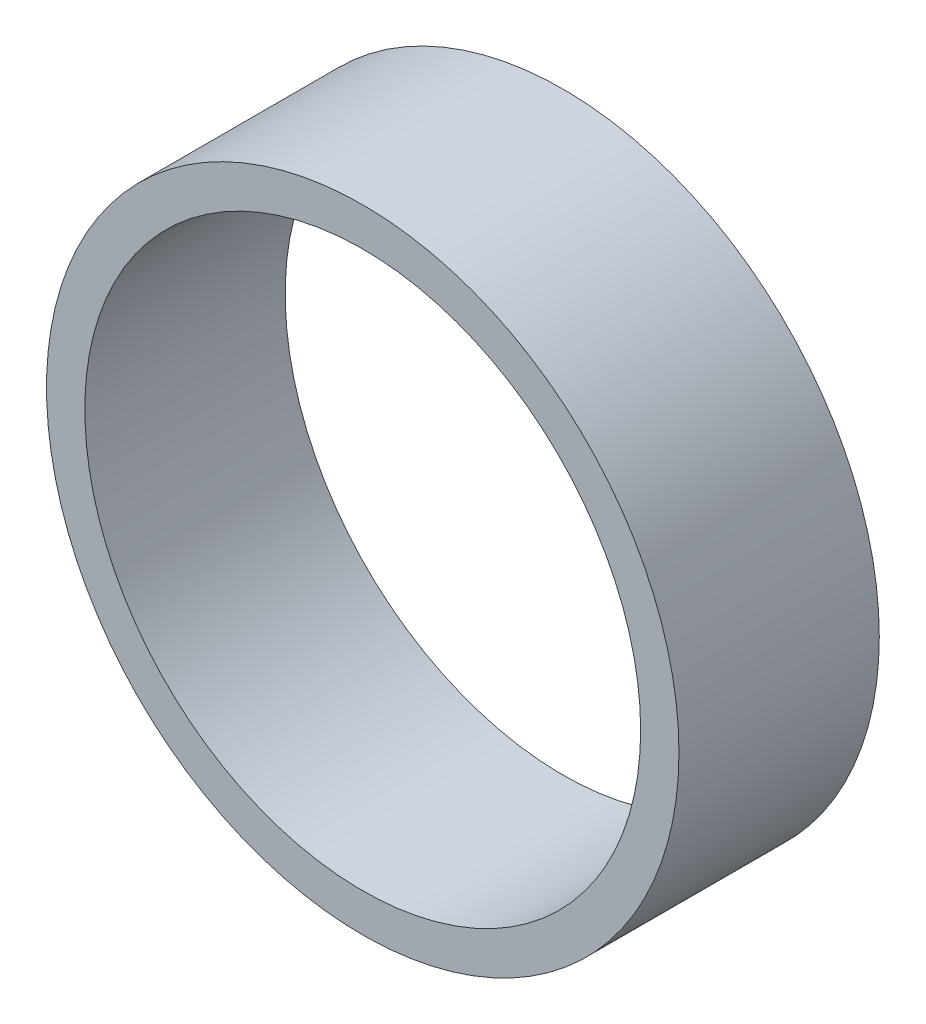
ISO-10303-21;
HEADER;
FILE_DESCRIPTION(('STEP AP214'),'2;1');
FILE_NAME('part.step','',(''),(''),'','','');
FILE_SCHEMA(('AUTOMOTIVE_DESIGN { 1 0 10303 214 1 1 1 1 }'));
ENDSEC;
DATA;
#1=APPLICATION_CONTEXT('core data for automotive mechanical design processes');
#2=APPLICATION_PROTOCOL_DEFINITION('international standard','automotive_design',2000,#1);
#3=PRODUCT_CONTEXT('',#1,'mechanical');
#4=PRODUCT('Part','Part','',(#3));
#5=PRODUCT_RELATED_PRODUCT_CATEGORY('part','',(#4));
#6=PRODUCT_DEFINITION_FORMATION('','',#4);
#7=PRODUCT_DEFINITION_CONTEXT('part definition',#1,'design');
#8=PRODUCT_DEFINITION('design','',#6,#7);
#9=PRODUCT_DEFINITION_SHAPE('','',#8);
#10=(LENGTH_UNIT() NAMED_UNIT(*) SI_UNIT(.MILLI.,.METRE.));
#11=(NAMED_UNIT(*) PLANE_ANGLE_UNIT() SI_UNIT($,.RADIAN.));
#12=(NAMED_UNIT(*) SI_UNIT($,.STERADIAN.) SOLID_ANGLE_UNIT());
#13=UNCERTAINTY_MEASURE_WITH_UNIT(LENGTH_MEASURE(1.E-05),#10,'distance_accuracy_value','');
#14=(GEOMETRIC_REPRESENTATION_CONTEXT(3) GLOBAL_UNCERTAINTY_ASSIGNED_CONTEXT((#13)) GLOBAL_UNIT_ASSIGNED_CONTEXT((#10,
#11,#12)) REPRESENTATION_CONTEXT('',''));
#15=CARTESIAN_POINT('',(0.,0.,0.));
#16=DIRECTION('',(0.,0.,1.));
#17=DIRECTION('',(1.,0.,0.));
#18=AXIS2_PLACEMENT_3D('',#15,#16,#17);
#19=CARTESIAN_POINT('',(10.7646458424915,-2.18920645114395,6.96));
#20=DIRECTION('',(0.,0.,1.));
#21=DIRECTION('',(1.,0.,0.));
#22=AXIS2_PLACEMENT_3D('',#19,#20,#21);
#23=PLANE('',#22);
#24=CARTESIAN_POINT('',(10.7646458424915,-2.18920645114395,6.96));
#25=DIRECTION('',(0.,0.,1.));
#26=DIRECTION('',(1.,0.,0.));
#27=AXIS2_PLACEMENT_3D('',#24,#25,#26);
#28=CIRCLE('',#27,9.655);
#29=CARTESIAN_POINT('',(20.4196458424915,-2.18920645114395,6.96));
#30=VERTEX_POINT('',#29);
#31=EDGE_CURVE('E52',#30,#30,#28,.T.);
#32=ORIENTED_EDGE('',*,*,#31,.F.);
#33=EDGE_LOOP('',(#32));
#34=FACE_BOUND('',#33,.T.);
#35=CARTESIAN_POINT('',(10.7646458424915,-2.18920645114395,6.96));
#36=DIRECTION('',(0.,0.,1.));
#37=DIRECTION('',(1.,0.,0.));
#38=AXIS2_PLACEMENT_3D('',#35,#36,#37);
#39=CIRCLE('',#38,10.985);
#40=CARTESIAN_POINT('',(21.7496458424915,-2.18920645114395,6.96));
#41=VERTEX_POINT('',#40);
#42=EDGE_CURVE('E10',#41,#41,#39,.T.);
#43=ORIENTED_EDGE('',*,*,#42,.T.);
#44=EDGE_LOOP('',(#43));
#45=FACE_BOUND('',#44,.T.);
#46=ADVANCED_FACE('F37',(#34,#45),#23,.T.);
#47=CARTESIAN_POINT('',(10.7646458424915,-2.18920645114395,0.));
#48=DIRECTION('',(0.,0.,1.));
#49=DIRECTION('',(1.,0.,0.));
#50=AXIS2_PLACEMENT_3D('',#47,#48,#49);
#51=PLANE('',#50);
#52=CARTESIAN_POINT('',(10.7646458424915,-2.18920645114395,0.));
#53=DIRECTION('',(0.,0.,1.));
#54=DIRECTION('',(1.,0.,0.));
#55=AXIS2_PLACEMENT_3D('',#52,#53,#54);
#56=CIRCLE('',#55,9.655);
#57=CARTESIAN_POINT('',(20.4196458424915,-2.18920645114395,0.));
#58=VERTEX_POINT('',#57);
#59=EDGE_CURVE('E50',#58,#58,#56,.T.);
#60=ORIENTED_EDGE('',*,*,#59,.T.);
#61=EDGE_LOOP('',(#60));
#62=FACE_BOUND('',#61,.T.);
#63=CARTESIAN_POINT('',(10.7646458424915,-2.18920645114395,0.));
#64=DIRECTION('',(0.,0.,1.));
#65=DIRECTION('',(1.,0.,0.));
#66=AXIS2_PLACEMENT_3D('',#63,#64,#65);
#67=CIRCLE('',#66,10.985);
#68=CARTESIAN_POINT('',(21.7496458424915,-2.18920645114395,0.));
#69=VERTEX_POINT('',#68);
#70=EDGE_CURVE('E41',#69,#69,#67,.T.);
#71=ORIENTED_EDGE('',*,*,#70,.F.);
#72=EDGE_LOOP('',(#71));
#73=FACE_BOUND('',#72,.T.);
#74=ADVANCED_FACE('F60',(#62,#73),#51,.F.);
#75=CARTESIAN_POINT('',(10.7646458424915,-2.18920645114395,6.96));
#76=DIRECTION('',(0.,0.,-1.));
#77=DIRECTION('',(-1.,0.,0.));
#78=AXIS2_PLACEMENT_3D('',#75,#76,#77);
#79=CYLINDRICAL_SURFACE('',#78,10.985);
#80=ORIENTED_EDGE('',*,*,#42,.F.);
#81=EDGE_LOOP('',(#80));
#82=FACE_BOUND('',#81,.T.);
#83=ORIENTED_EDGE('',*,*,#70,.T.);
#84=EDGE_LOOP('',(#83));
#85=FACE_BOUND('',#84,.T.);
#86=ADVANCED_FACE('F39',(#82,#85),#79,.T.);
#87=CARTESIAN_POINT('',(10.7646458424915,-2.18920645114395,0.));
#88=DIRECTION('',(0.,0.,1.));
#89=DIRECTION('',(1.,0.,0.));
#90=AXIS2_PLACEMENT_3D('',#87,#88,#89);
#91=CYLINDRICAL_SURFACE('',#90,9.655);
#92=ORIENTED_EDGE('',*,*,#59,.F.);
#93=EDGE_LOOP('',(#92));
#94=FACE_BOUND('',#93,.T.);
#95=ORIENTED_EDGE('',*,*,#31,.T.);
#96=EDGE_LOOP('',(#95));
#97=FACE_BOUND('',#96,.T.);
#98=ADVANCED_FACE('F63',(#94,#97),#91,.F.);
#99=CLOSED_SHELL('',(#46,#74,#86,#98));
#100=MANIFOLD_SOLID_BREP('B2',#99);
#101=ADVANCED_BREP_SHAPE_REPRESENTATION('',(#18,#100),#14);
#102=SHAPE_DEFINITION_REPRESENTATION(#9,#101);
ENDSEC;
END-ISO-10303-21;
